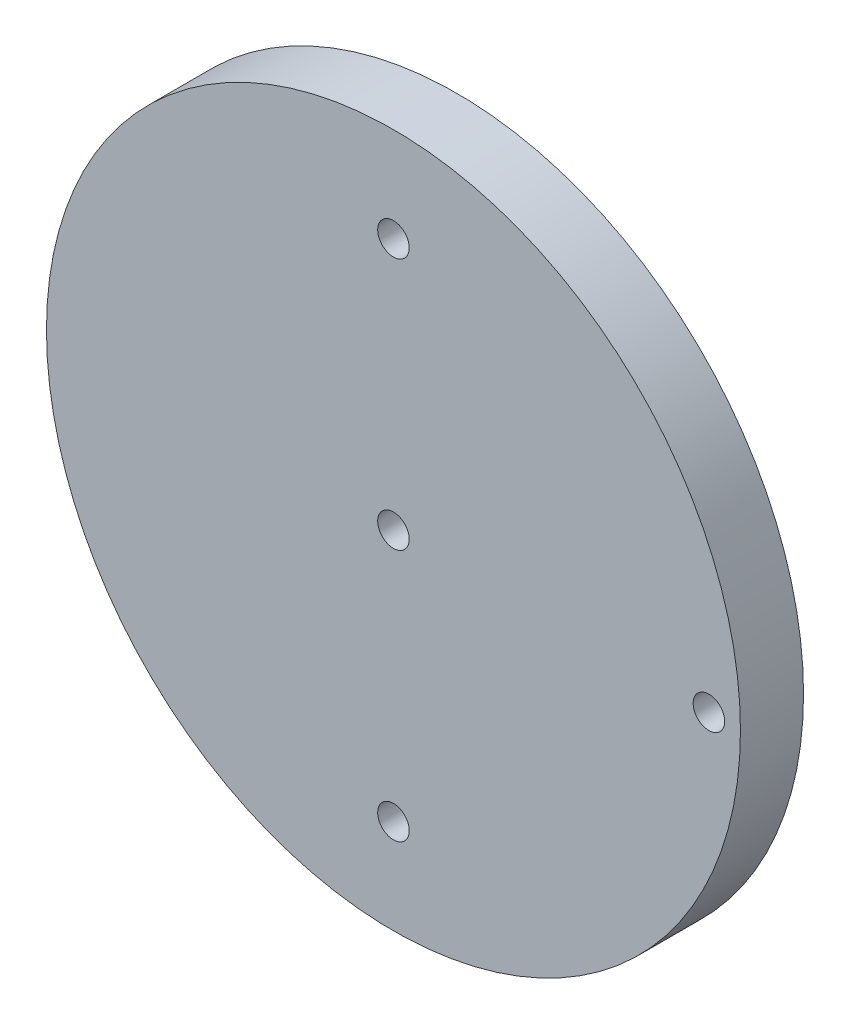
ISO-10303-21;
HEADER;
FILE_DESCRIPTION(('STEP AP214'),'2;1');
FILE_NAME('part.step','',(''),(''),'','','');
FILE_SCHEMA(('AUTOMOTIVE_DESIGN { 1 0 10303 214 1 1 1 1 }'));
ENDSEC;
DATA;
#1=APPLICATION_CONTEXT('core data for automotive mechanical design processes');
#2=APPLICATION_PROTOCOL_DEFINITION('international standard','automotive_design',2000,#1);
#3=PRODUCT_CONTEXT('',#1,'mechanical');
#4=PRODUCT('Part','Part','',(#3));
#5=PRODUCT_RELATED_PRODUCT_CATEGORY('part','',(#4));
#6=PRODUCT_DEFINITION_FORMATION('','',#4);
#7=PRODUCT_DEFINITION_CONTEXT('part definition',#1,'design');
#8=PRODUCT_DEFINITION('design','',#6,#7);
#9=PRODUCT_DEFINITION_SHAPE('','',#8);
#10=(LENGTH_UNIT() NAMED_UNIT(*) SI_UNIT(.MILLI.,.METRE.));
#11=(NAMED_UNIT(*) PLANE_ANGLE_UNIT() SI_UNIT($,.RADIAN.));
#12=(NAMED_UNIT(*) SI_UNIT($,.STERADIAN.) SOLID_ANGLE_UNIT());
#13=UNCERTAINTY_MEASURE_WITH_UNIT(LENGTH_MEASURE(1.E-05),#10,'distance_accuracy_value','');
#14=(GEOMETRIC_REPRESENTATION_CONTEXT(3) GLOBAL_UNCERTAINTY_ASSIGNED_CONTEXT((#13)) GLOBAL_UNIT_ASSIGNED_CONTEXT((#10,
#11,#12)) REPRESENTATION_CONTEXT('',''));
#15=CARTESIAN_POINT('',(0.,0.,0.));
#16=DIRECTION('',(0.,0.,1.));
#17=DIRECTION('',(1.,0.,0.));
#18=AXIS2_PLACEMENT_3D('',#15,#16,#17);
#19=CARTESIAN_POINT('',(0.,0.,10.));
#20=DIRECTION('',(0.,0.,1.));
#21=DIRECTION('',(1.,0.,0.));
#22=AXIS2_PLACEMENT_3D('',#19,#20,#21);
#23=PLANE('',#22);
#24=CARTESIAN_POINT('',(0.,40.,10.));
#25=DIRECTION('',(0.,0.,-1.));
#26=DIRECTION('',(-1.,0.,0.));
#27=AXIS2_PLACEMENT_3D('',#24,#25,#26);
#28=CIRCLE('',#27,2.5);
#29=CARTESIAN_POINT('',(-2.50000000000001,40.,10.));
#30=VERTEX_POINT('',#29);
#31=EDGE_CURVE('E65',#30,#30,#28,.F.);
#32=ORIENTED_EDGE('',*,*,#31,.F.);
#33=EDGE_LOOP('',(#32));
#34=FACE_BOUND('',#33,.T.);
#35=CARTESIAN_POINT('',(0.,0.,10.));
#36=DIRECTION('',(0.,0.,1.));
#37=DIRECTION('',(1.,0.,0.));
#38=AXIS2_PLACEMENT_3D('',#35,#36,#37);
#39=CIRCLE('',#38,2.5);
#40=CARTESIAN_POINT('',(2.5,0.,10.));
#41=VERTEX_POINT('',#40);
#42=EDGE_CURVE('E57',#41,#41,#39,.T.);
#43=ORIENTED_EDGE('',*,*,#42,.F.);
#44=EDGE_LOOP('',(#43));
#45=FACE_BOUND('',#44,.T.);
#46=CARTESIAN_POINT('',(50.,0.,10.));
#47=DIRECTION('',(0.,0.,1.));
#48=DIRECTION('',(1.,0.,0.));
#49=AXIS2_PLACEMENT_3D('',#46,#47,#48);
#50=CIRCLE('',#49,2.5);
#51=CARTESIAN_POINT('',(52.5,0.,10.));
#52=VERTEX_POINT('',#51);
#53=EDGE_CURVE('E50',#52,#52,#50,.T.);
#54=ORIENTED_EDGE('',*,*,#53,.F.);
#55=EDGE_LOOP('',(#54));
#56=FACE_BOUND('',#55,.T.);
#57=CARTESIAN_POINT('',(0.,0.,10.));
#58=DIRECTION('',(0.,0.,1.));
#59=DIRECTION('',(1.,0.,0.));
#60=AXIS2_PLACEMENT_3D('',#57,#58,#59);
#61=CIRCLE('',#60,55.);
#62=CARTESIAN_POINT('',(55.,0.,10.));
#63=VERTEX_POINT('',#62);
#64=EDGE_CURVE('E10',#63,#63,#61,.T.);
#65=ORIENTED_EDGE('',*,*,#64,.T.);
#66=EDGE_LOOP('',(#65));
#67=FACE_BOUND('',#66,.T.);
#68=CARTESIAN_POINT('',(0.,-40.,10.));
#69=DIRECTION('',(0.,0.,-1.));
#70=DIRECTION('',(-1.,0.,0.));
#71=AXIS2_PLACEMENT_3D('',#68,#69,#70);
#72=CIRCLE('',#71,2.5);
#73=CARTESIAN_POINT('',(-2.50000000000001,-40.,10.));
#74=VERTEX_POINT('',#73);
#75=EDGE_CURVE('E54',#74,#74,#72,.T.);
#76=ORIENTED_EDGE('',*,*,#75,.T.);
#77=EDGE_LOOP('',(#76));
#78=FACE_BOUND('',#77,.T.);
#79=ADVANCED_FACE('F37',(#34,#45,#56,#67,#78),#23,.T.);
#80=CARTESIAN_POINT('',(0.,0.,0.));
#81=DIRECTION('',(0.,0.,1.));
#82=DIRECTION('',(1.,0.,0.));
#83=AXIS2_PLACEMENT_3D('',#80,#81,#82);
#84=PLANE('',#83);
#85=CARTESIAN_POINT('',(0.,0.,0.));
#86=DIRECTION('',(0.,0.,1.));
#87=DIRECTION('',(1.,0.,0.));
#88=AXIS2_PLACEMENT_3D('',#85,#86,#87);
#89=CIRCLE('',#88,55.);
#90=CARTESIAN_POINT('',(55.,0.,0.));
#91=VERTEX_POINT('',#90);
#92=EDGE_CURVE('E41',#91,#91,#89,.T.);
#93=ORIENTED_EDGE('',*,*,#92,.F.);
#94=EDGE_LOOP('',(#93));
#95=FACE_BOUND('',#94,.T.);
#96=CARTESIAN_POINT('',(50.,0.,0.));
#97=DIRECTION('',(0.,0.,1.));
#98=DIRECTION('',(1.,0.,0.));
#99=AXIS2_PLACEMENT_3D('',#96,#97,#98);
#100=CIRCLE('',#99,2.5);
#101=CARTESIAN_POINT('',(52.5,0.,0.));
#102=VERTEX_POINT('',#101);
#103=EDGE_CURVE('E53',#102,#102,#100,.T.);
#104=ORIENTED_EDGE('',*,*,#103,.T.);
#105=EDGE_LOOP('',(#104));
#106=FACE_BOUND('',#105,.T.);
#107=CARTESIAN_POINT('',(0.,0.,0.));
#108=DIRECTION('',(0.,0.,1.));
#109=DIRECTION('',(1.,0.,0.));
#110=AXIS2_PLACEMENT_3D('',#107,#108,#109);
#111=CIRCLE('',#110,2.5);
#112=CARTESIAN_POINT('',(2.5,0.,0.));
#113=VERTEX_POINT('',#112);
#114=EDGE_CURVE('E48',#113,#113,#111,.T.);
#115=ORIENTED_EDGE('',*,*,#114,.T.);
#116=EDGE_LOOP('',(#115));
#117=FACE_BOUND('',#116,.T.);
#118=CARTESIAN_POINT('',(0.,40.,0.));
#119=DIRECTION('',(0.,0.,-1.));
#120=DIRECTION('',(-1.,0.,0.));
#121=AXIS2_PLACEMENT_3D('',#118,#119,#120);
#122=CIRCLE('',#121,2.5);
#123=CARTESIAN_POINT('',(-2.50000000000001,40.,0.));
#124=VERTEX_POINT('',#123);
#125=EDGE_CURVE('E62',#124,#124,#122,.F.);
#126=ORIENTED_EDGE('',*,*,#125,.T.);
#127=EDGE_LOOP('',(#126));
#128=FACE_BOUND('',#127,.T.);
#129=CARTESIAN_POINT('',(0.,-40.,0.));
#130=DIRECTION('',(0.,0.,-1.));
#131=DIRECTION('',(-1.,0.,0.));
#132=AXIS2_PLACEMENT_3D('',#129,#130,#131);
#133=CIRCLE('',#132,2.5);
#134=CARTESIAN_POINT('',(-2.50000000000001,-40.,0.));
#135=VERTEX_POINT('',#134);
#136=EDGE_CURVE('E68',#135,#135,#133,.T.);
#137=ORIENTED_EDGE('',*,*,#136,.F.);
#138=EDGE_LOOP('',(#137));
#139=FACE_BOUND('',#138,.T.);
#140=ADVANCED_FACE('F82',(#95,#106,#117,#128,#139),#84,.F.);
#141=CARTESIAN_POINT('',(0.,0.,10.));
#142=DIRECTION('',(0.,0.,-1.));
#143=DIRECTION('',(-1.,0.,0.));
#144=AXIS2_PLACEMENT_3D('',#141,#142,#143);
#145=CYLINDRICAL_SURFACE('',#144,55.);
#146=ORIENTED_EDGE('',*,*,#64,.F.);
#147=EDGE_LOOP('',(#146));
#148=FACE_BOUND('',#147,.T.);
#149=ORIENTED_EDGE('',*,*,#92,.T.);
#150=EDGE_LOOP('',(#149));
#151=FACE_BOUND('',#150,.T.);
#152=ADVANCED_FACE('F39',(#148,#151),#145,.T.);
#153=CARTESIAN_POINT('',(50.,0.,0.));
#154=DIRECTION('',(0.,0.,1.));
#155=DIRECTION('',(1.,0.,0.));
#156=AXIS2_PLACEMENT_3D('',#153,#154,#155);
#157=CYLINDRICAL_SURFACE('',#156,2.5);
#158=ORIENTED_EDGE('',*,*,#103,.F.);
#159=EDGE_LOOP('',(#158));
#160=FACE_BOUND('',#159,.T.);
#161=ORIENTED_EDGE('',*,*,#53,.T.);
#162=EDGE_LOOP('',(#161));
#163=FACE_BOUND('',#162,.T.);
#164=ADVANCED_FACE('F90',(#160,#163),#157,.F.);
#165=CARTESIAN_POINT('',(0.,0.,0.));
#166=DIRECTION('',(0.,0.,1.));
#167=DIRECTION('',(1.,0.,0.));
#168=AXIS2_PLACEMENT_3D('',#165,#166,#167);
#169=CYLINDRICAL_SURFACE('',#168,2.5);
#170=ORIENTED_EDGE('',*,*,#114,.F.);
#171=EDGE_LOOP('',(#170));
#172=FACE_BOUND('',#171,.T.);
#173=ORIENTED_EDGE('',*,*,#42,.T.);
#174=EDGE_LOOP('',(#173));
#175=FACE_BOUND('',#174,.T.);
#176=ADVANCED_FACE('F99',(#172,#175),#169,.F.);
#177=CARTESIAN_POINT('',(0.,40.,10.));
#178=DIRECTION('',(0.,0.,-1.));
#179=DIRECTION('',(-1.,0.,0.));
#180=AXIS2_PLACEMENT_3D('',#177,#178,#179);
#181=CYLINDRICAL_SURFACE('',#180,2.5);
#182=ORIENTED_EDGE('',*,*,#31,.T.);
#183=EDGE_LOOP('',(#182));
#184=FACE_BOUND('',#183,.T.);
#185=ORIENTED_EDGE('',*,*,#125,.F.);
#186=EDGE_LOOP('',(#185));
#187=FACE_BOUND('',#186,.T.);
#188=ADVANCED_FACE('F78',(#184,#187),#181,.F.);
#189=CARTESIAN_POINT('',(0.,-40.,10.));
#190=DIRECTION('',(0.,0.,-1.));
#191=DIRECTION('',(-1.,0.,0.));
#192=AXIS2_PLACEMENT_3D('',#189,#190,#191);
#193=CYLINDRICAL_SURFACE('',#192,2.5);
#194=ORIENTED_EDGE('',*,*,#75,.F.);
#195=EDGE_LOOP('',(#194));
#196=FACE_BOUND('',#195,.T.);
#197=ORIENTED_EDGE('',*,*,#136,.T.);
#198=EDGE_LOOP('',(#197));
#199=FACE_BOUND('',#198,.T.);
#200=ADVANCED_FACE('F75',(#196,#199),#193,.F.);
#201=CLOSED_SHELL('',(#79,#140,#152,#164,#176,#188,#200));
#202=MANIFOLD_SOLID_BREP('B2',#201);
#203=ADVANCED_BREP_SHAPE_REPRESENTATION('',(#18,#202),#14);
#204=SHAPE_DEFINITION_REPRESENTATION(#9,#203);
ENDSEC;
END-ISO-10303-21;
